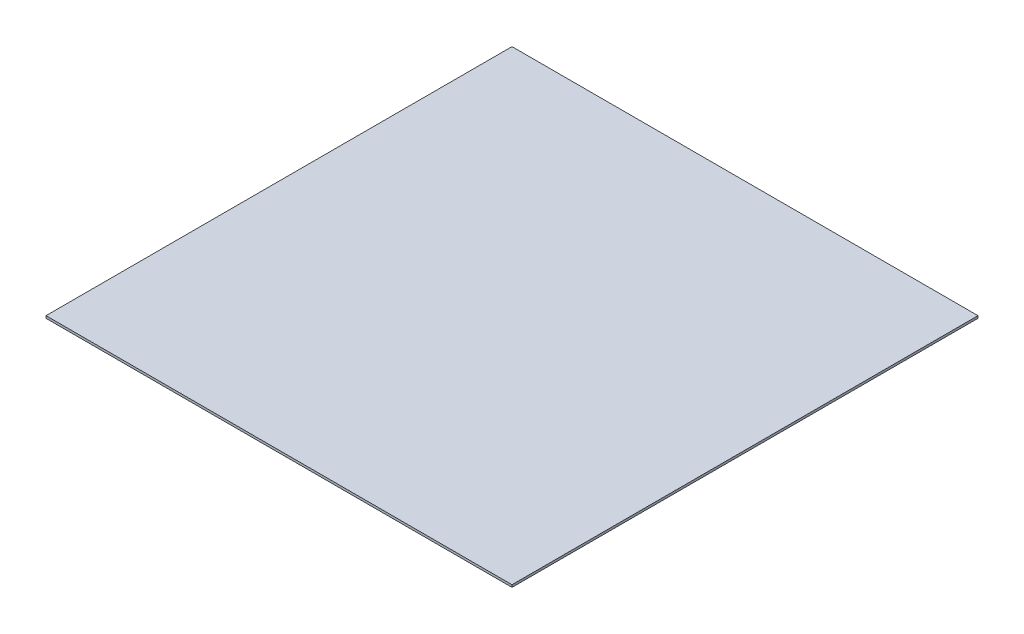
ISO-10303-21;
HEADER;
FILE_DESCRIPTION(('STEP AP214'),'2;1');
FILE_NAME('part.step','',(''),(''),'','','');
FILE_SCHEMA(('AUTOMOTIVE_DESIGN { 1 0 10303 214 1 1 1 1 }'));
ENDSEC;
DATA;
#1=APPLICATION_CONTEXT('core data for automotive mechanical design processes');
#2=APPLICATION_PROTOCOL_DEFINITION('international standard','automotive_design',2000,#1);
#3=PRODUCT_CONTEXT('',#1,'mechanical');
#4=PRODUCT('Part','Part','',(#3));
#5=PRODUCT_RELATED_PRODUCT_CATEGORY('part','',(#4));
#6=PRODUCT_DEFINITION_FORMATION('','',#4);
#7=PRODUCT_DEFINITION_CONTEXT('part definition',#1,'design');
#8=PRODUCT_DEFINITION('design','',#6,#7);
#9=PRODUCT_DEFINITION_SHAPE('','',#8);
#10=(LENGTH_UNIT() NAMED_UNIT(*) SI_UNIT(.MILLI.,.METRE.));
#11=(NAMED_UNIT(*) PLANE_ANGLE_UNIT() SI_UNIT($,.RADIAN.));
#12=(NAMED_UNIT(*) SI_UNIT($,.STERADIAN.) SOLID_ANGLE_UNIT());
#13=UNCERTAINTY_MEASURE_WITH_UNIT(LENGTH_MEASURE(1.E-05),#10,'distance_accuracy_value','');
#14=(GEOMETRIC_REPRESENTATION_CONTEXT(3) GLOBAL_UNCERTAINTY_ASSIGNED_CONTEXT((#13)) GLOBAL_UNIT_ASSIGNED_CONTEXT((#10,
#11,#12)) REPRESENTATION_CONTEXT('',''));
#15=CARTESIAN_POINT('',(0.,0.,0.));
#16=DIRECTION('',(0.,0.,1.));
#17=DIRECTION('',(1.,0.,0.));
#18=AXIS2_PLACEMENT_3D('',#15,#16,#17);
#19=CARTESIAN_POINT('',(0.,12.7,0.));
#20=DIRECTION('',(1.,0.,0.));
#21=DIRECTION('',(0.,0.,-1.));
#22=AXIS2_PLACEMENT_3D('',#19,#20,#21);
#23=PLANE('',#22);
#24=DIRECTION('',(0.,0.,1.));
#25=VECTOR('',#24,1.);
#26=CARTESIAN_POINT('',(0.,0.,0.));
#27=LINE('',#26,#25);
#28=CARTESIAN_POINT('',(0.,0.,-2540.));
#29=VERTEX_POINT('',#28);
#30=CARTESIAN_POINT('',(0.,0.,0.));
#31=VERTEX_POINT('',#30);
#32=EDGE_CURVE('E98',#29,#31,#27,.T.);
#33=ORIENTED_EDGE('',*,*,#32,.T.);
#34=DIRECTION('',(0.,-1.,0.));
#35=VECTOR('',#34,1.);
#36=CARTESIAN_POINT('',(0.,12.7,0.));
#37=LINE('',#36,#35);
#38=CARTESIAN_POINT('',(0.,12.7,0.));
#39=VERTEX_POINT('',#38);
#40=EDGE_CURVE('E11',#39,#31,#37,.T.);
#41=ORIENTED_EDGE('',*,*,#40,.F.);
#42=DIRECTION('',(0.,0.,1.));
#43=VECTOR('',#42,1.);
#44=CARTESIAN_POINT('',(0.,12.7,0.));
#45=LINE('',#44,#43);
#46=CARTESIAN_POINT('',(0.,12.7,-2540.));
#47=VERTEX_POINT('',#46);
#48=EDGE_CURVE('E86',#47,#39,#45,.T.);
#49=ORIENTED_EDGE('',*,*,#48,.F.);
#50=DIRECTION('',(0.,-1.,0.));
#51=VECTOR('',#50,1.);
#52=CARTESIAN_POINT('',(0.,12.7,-2540.));
#53=LINE('',#52,#51);
#54=EDGE_CURVE('E94',#47,#29,#53,.T.);
#55=ORIENTED_EDGE('',*,*,#54,.T.);
#56=EDGE_LOOP('',(#33,#41,#49,#55));
#57=FACE_BOUND('',#56,.T.);
#58=ADVANCED_FACE('F35',(#57),#23,.F.);
#59=CARTESIAN_POINT('',(0.,12.7,0.));
#60=DIRECTION('',(0.,0.,-1.));
#61=DIRECTION('',(-1.,0.,0.));
#62=AXIS2_PLACEMENT_3D('',#59,#60,#61);
#63=PLANE('',#62);
#64=DIRECTION('',(1.,0.,0.));
#65=VECTOR('',#64,1.);
#66=CARTESIAN_POINT('',(0.,0.,0.));
#67=LINE('',#66,#65);
#68=CARTESIAN_POINT('',(2540.,0.,0.));
#69=VERTEX_POINT('',#68);
#70=EDGE_CURVE('E90',#31,#69,#67,.T.);
#71=ORIENTED_EDGE('',*,*,#70,.T.);
#72=DIRECTION('',(0.,-1.,0.));
#73=VECTOR('',#72,1.);
#74=CARTESIAN_POINT('',(2540.,12.7,0.));
#75=LINE('',#74,#73);
#76=CARTESIAN_POINT('',(2540.,12.7,0.));
#77=VERTEX_POINT('',#76);
#78=EDGE_CURVE('E43',#77,#69,#75,.T.);
#79=ORIENTED_EDGE('',*,*,#78,.F.);
#80=DIRECTION('',(1.,0.,0.));
#81=VECTOR('',#80,1.);
#82=CARTESIAN_POINT('',(0.,12.7,0.));
#83=LINE('',#82,#81);
#84=EDGE_CURVE('E81',#39,#77,#83,.T.);
#85=ORIENTED_EDGE('',*,*,#84,.F.);
#86=ORIENTED_EDGE('',*,*,#40,.T.);
#87=EDGE_LOOP('',(#71,#79,#85,#86));
#88=FACE_BOUND('',#87,.T.);
#89=ADVANCED_FACE('F89',(#88),#63,.F.);
#90=CARTESIAN_POINT('',(2540.,12.7,0.));
#91=DIRECTION('',(-1.,0.,0.));
#92=DIRECTION('',(0.,0.,1.));
#93=AXIS2_PLACEMENT_3D('',#90,#91,#92);
#94=PLANE('',#93);
#95=DIRECTION('',(0.,0.,-1.));
#96=VECTOR('',#95,1.);
#97=CARTESIAN_POINT('',(2540.,0.,0.));
#98=LINE('',#97,#96);
#99=CARTESIAN_POINT('',(2540.,0.,-2540.));
#100=VERTEX_POINT('',#99);
#101=EDGE_CURVE('E68',#69,#100,#98,.T.);
#102=ORIENTED_EDGE('',*,*,#101,.T.);
#103=DIRECTION('',(0.,-1.,0.));
#104=VECTOR('',#103,1.);
#105=CARTESIAN_POINT('',(2540.,12.7,-2540.));
#106=LINE('',#105,#104);
#107=CARTESIAN_POINT('',(2540.,12.7,-2540.));
#108=VERTEX_POINT('',#107);
#109=EDGE_CURVE('E91',#108,#100,#106,.T.);
#110=ORIENTED_EDGE('',*,*,#109,.F.);
#111=DIRECTION('',(0.,0.,-1.));
#112=VECTOR('',#111,1.);
#113=CARTESIAN_POINT('',(2540.,12.7,0.));
#114=LINE('',#113,#112);
#115=EDGE_CURVE('E84',#77,#108,#114,.T.);
#116=ORIENTED_EDGE('',*,*,#115,.F.);
#117=ORIENTED_EDGE('',*,*,#78,.T.);
#118=EDGE_LOOP('',(#102,#110,#116,#117));
#119=FACE_BOUND('',#118,.T.);
#120=ADVANCED_FACE('F92',(#119),#94,.F.);
#121=CARTESIAN_POINT('',(0.,12.7,-2540.));
#122=DIRECTION('',(0.,0.,1.));
#123=DIRECTION('',(1.,0.,0.));
#124=AXIS2_PLACEMENT_3D('',#121,#122,#123);
#125=PLANE('',#124);
#126=DIRECTION('',(-1.,0.,0.));
#127=VECTOR('',#126,1.);
#128=CARTESIAN_POINT('',(0.,0.,-2540.));
#129=LINE('',#128,#127);
#130=EDGE_CURVE('E74',#100,#29,#129,.T.);
#131=ORIENTED_EDGE('',*,*,#130,.T.);
#132=ORIENTED_EDGE('',*,*,#54,.F.);
#133=DIRECTION('',(-1.,0.,0.));
#134=VECTOR('',#133,1.);
#135=CARTESIAN_POINT('',(0.,12.7,-2540.));
#136=LINE('',#135,#134);
#137=EDGE_CURVE('E51',#108,#47,#136,.T.);
#138=ORIENTED_EDGE('',*,*,#137,.F.);
#139=ORIENTED_EDGE('',*,*,#109,.T.);
#140=EDGE_LOOP('',(#131,#132,#138,#139));
#141=FACE_BOUND('',#140,.T.);
#142=ADVANCED_FACE('F105',(#141),#125,.F.);
#143=CARTESIAN_POINT('',(0.,12.7,0.));
#144=DIRECTION('',(0.,-1.,0.));
#145=DIRECTION('',(0.,0.,-1.));
#146=AXIS2_PLACEMENT_3D('',#143,#144,#145);
#147=PLANE('',#146);
#148=ORIENTED_EDGE('',*,*,#48,.T.);
#149=ORIENTED_EDGE('',*,*,#84,.T.);
#150=ORIENTED_EDGE('',*,*,#115,.T.);
#151=ORIENTED_EDGE('',*,*,#137,.T.);
#152=EDGE_LOOP('',(#148,#149,#150,#151));
#153=FACE_BOUND('',#152,.T.);
#154=ADVANCED_FACE('F82',(#153),#147,.F.);
#155=CARTESIAN_POINT('',(0.,0.,0.));
#156=DIRECTION('',(0.,-1.,0.));
#157=DIRECTION('',(0.,0.,-1.));
#158=AXIS2_PLACEMENT_3D('',#155,#156,#157);
#159=PLANE('',#158);
#160=ORIENTED_EDGE('',*,*,#32,.F.);
#161=ORIENTED_EDGE('',*,*,#130,.F.);
#162=ORIENTED_EDGE('',*,*,#101,.F.);
#163=ORIENTED_EDGE('',*,*,#70,.F.);
#164=EDGE_LOOP('',(#160,#161,#162,#163));
#165=FACE_BOUND('',#164,.T.);
#166=ADVANCED_FACE('F108',(#165),#159,.T.);
#167=CLOSED_SHELL('',(#58,#89,#120,#142,#154,#166));
#168=MANIFOLD_SOLID_BREP('B2',#167);
#169=ADVANCED_BREP_SHAPE_REPRESENTATION('',(#18,#168),#14);
#170=SHAPE_DEFINITION_REPRESENTATION(#9,#169);
ENDSEC;
END-ISO-10303-21;
